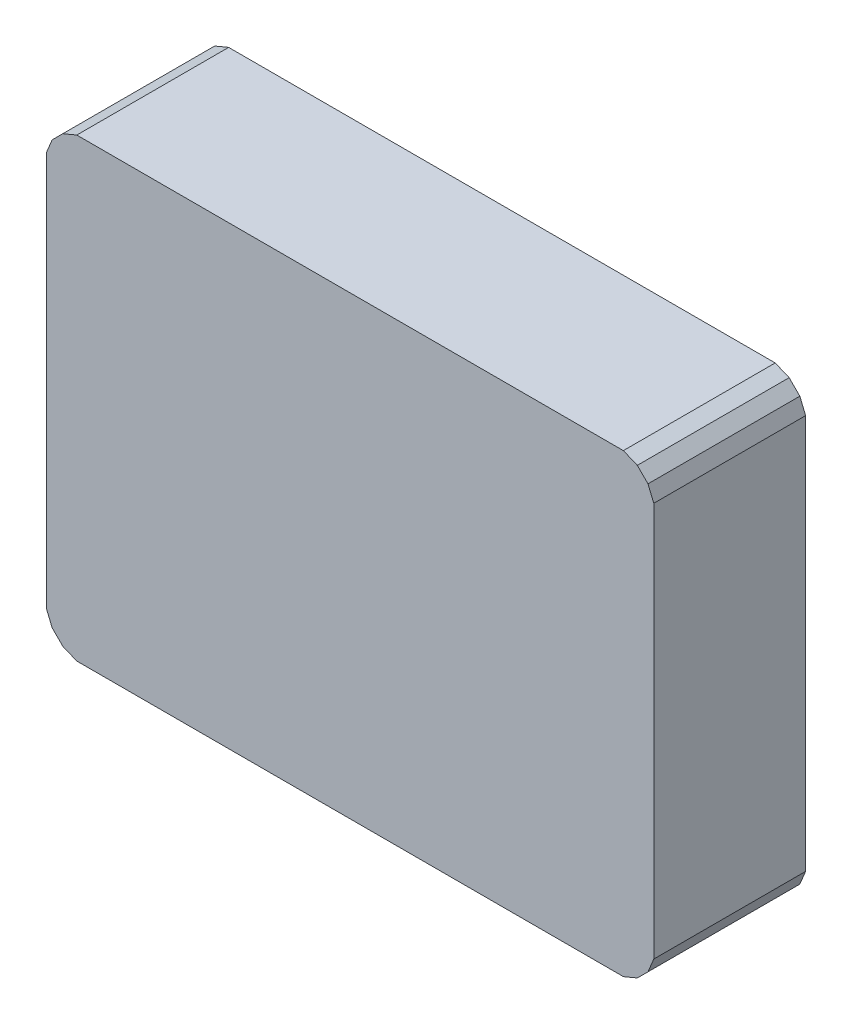
ISO-10303-21;
HEADER;
FILE_DESCRIPTION(('STEP AP214'),'2;1');
FILE_NAME('part.step','',(''),(''),'','','');
FILE_SCHEMA(('AUTOMOTIVE_DESIGN { 1 0 10303 214 1 1 1 1 }'));
ENDSEC;
DATA;
#1=APPLICATION_CONTEXT('core data for automotive mechanical design processes');
#2=APPLICATION_PROTOCOL_DEFINITION('international standard','automotive_design',2000,#1);
#3=PRODUCT_CONTEXT('',#1,'mechanical');
#4=PRODUCT('Part','Part','',(#3));
#5=PRODUCT_RELATED_PRODUCT_CATEGORY('part','',(#4));
#6=PRODUCT_DEFINITION_FORMATION('','',#4);
#7=PRODUCT_DEFINITION_CONTEXT('part definition',#1,'design');
#8=PRODUCT_DEFINITION('design','',#6,#7);
#9=PRODUCT_DEFINITION_SHAPE('','',#8);
#10=(LENGTH_UNIT() NAMED_UNIT(*) SI_UNIT(.MILLI.,.METRE.));
#11=(NAMED_UNIT(*) PLANE_ANGLE_UNIT() SI_UNIT($,.RADIAN.));
#12=(NAMED_UNIT(*) SI_UNIT($,.STERADIAN.) SOLID_ANGLE_UNIT());
#13=UNCERTAINTY_MEASURE_WITH_UNIT(LENGTH_MEASURE(1.E-05),#10,'distance_accuracy_value','');
#14=(GEOMETRIC_REPRESENTATION_CONTEXT(3) GLOBAL_UNCERTAINTY_ASSIGNED_CONTEXT((#13)) GLOBAL_UNIT_ASSIGNED_CONTEXT((#10,
#11,#12)) REPRESENTATION_CONTEXT('',''));
#15=CARTESIAN_POINT('',(0.,0.,0.));
#16=DIRECTION('',(0.,0.,1.));
#17=DIRECTION('',(1.,0.,0.));
#18=AXIS2_PLACEMENT_3D('',#15,#16,#17);
#19=CARTESIAN_POINT('',(2.00000108,1.25000004,1.00000054));
#20=DIRECTION('',(0.,0.,-1.));
#21=DIRECTION('',(-1.,0.,0.));
#22=AXIS2_PLACEMENT_3D('',#19,#20,#21);
#23=PLANE('',#22);
#24=DIRECTION('',(0.382692373326559,-0.923875828993099,0.));
#25=VECTOR('',#24,1.);
#26=CARTESIAN_POINT('',(1.96193918,1.39161266,1.00000054));
#27=LINE('',#26,#25);
#28=CARTESIAN_POINT('',(1.96193917999999,1.39161266,1.00000054));
#29=VERTEX_POINT('',#28);
#30=CARTESIAN_POINT('',(2.00000108,1.29972562,1.00000054));
#31=VERTEX_POINT('',#30);
#32=EDGE_CURVE('E149',#29,#31,#27,.T.);
#33=ORIENTED_EDGE('',*,*,#32,.F.);
#34=DIRECTION('',(0.707106781186547,-0.707106781186547,0.));
#35=VECTOR('',#34,1.);
#36=CARTESIAN_POINT('',(1.8916142,1.46193764,1.00000054));
#37=LINE('',#36,#35);
#38=CARTESIAN_POINT('',(1.8916142,1.46193764,1.00000054));
#39=VERTEX_POINT('',#38);
#40=EDGE_CURVE('E148',#39,#29,#37,.T.);
#41=ORIENTED_EDGE('',*,*,#40,.F.);
#42=DIRECTION('',(0.923875828993099,-0.382692373326558,0.));
#43=VECTOR('',#42,1.);
#44=CARTESIAN_POINT('',(1.79972716,1.49999954,1.00000054));
#45=LINE('',#44,#43);
#46=CARTESIAN_POINT('',(1.79972716,1.49999954000001,1.00000054));
#47=VERTEX_POINT('',#46);
#48=EDGE_CURVE('E20',#47,#39,#45,.T.);
#49=ORIENTED_EDGE('',*,*,#48,.F.);
#50=DIRECTION('',(1.,0.,0.));
#51=VECTOR('',#50,1.);
#52=CARTESIAN_POINT('',(1.75000158,1.49999954,1.00000054));
#53=LINE('',#52,#51);
#54=CARTESIAN_POINT('',(-1.79972716,1.49999954,1.00000054));
#55=VERTEX_POINT('',#54);
#56=EDGE_CURVE('E132',#47,#55,#53,.F.);
#57=ORIENTED_EDGE('',*,*,#56,.T.);
#58=DIRECTION('',(0.923875828992928,0.38269237332697,0.));
#59=VECTOR('',#58,1.);
#60=CARTESIAN_POINT('',(-1.79972716,1.49999954,1.00000054));
#61=LINE('',#60,#59);
#62=CARTESIAN_POINT('',(-1.8916142,1.46193763999999,1.00000054));
#63=VERTEX_POINT('',#62);
#64=EDGE_CURVE('E199',#55,#63,#61,.F.);
#65=ORIENTED_EDGE('',*,*,#64,.T.);
#66=DIRECTION('',(0.707106781186548,0.707106781186548,0.));
#67=VECTOR('',#66,1.);
#68=CARTESIAN_POINT('',(-1.8916142,1.46193764,1.00000054));
#69=LINE('',#68,#67);
#70=CARTESIAN_POINT('',(-1.96193918,1.39161266,1.00000054));
#71=VERTEX_POINT('',#70);
#72=EDGE_CURVE('E195',#63,#71,#69,.F.);
#73=ORIENTED_EDGE('',*,*,#72,.T.);
#74=DIRECTION('',(0.382670574824983,0.923884858173959,0.));
#75=VECTOR('',#74,1.);
#76=CARTESIAN_POINT('',(-1.96193918,1.39161266,1.00000054));
#77=LINE('',#76,#75);
#78=CARTESIAN_POINT('',(-1.99999853999999,1.29972562,1.00000054));
#79=VERTEX_POINT('',#78);
#80=EDGE_CURVE('E190',#71,#79,#77,.F.);
#81=ORIENTED_EDGE('',*,*,#80,.T.);
#82=DIRECTION('',(0.,1.,0.));
#83=VECTOR('',#82,1.);
#84=CARTESIAN_POINT('',(-1.99999854,1.29972562,1.00000054));
#85=LINE('',#84,#83);
#86=CARTESIAN_POINT('',(-1.99999854,-1.29972816,1.00000054));
#87=VERTEX_POINT('',#86);
#88=EDGE_CURVE('E188',#79,#87,#85,.F.);
#89=ORIENTED_EDGE('',*,*,#88,.T.);
#90=DIRECTION('',(-0.382670574824983,0.923884858173959,0.));
#91=VECTOR('',#90,1.);
#92=CARTESIAN_POINT('',(-1.99999854,-1.29972816,1.00000054));
#93=LINE('',#92,#91);
#94=CARTESIAN_POINT('',(-1.96193918000001,-1.3916152,1.00000054));
#95=VERTEX_POINT('',#94);
#96=EDGE_CURVE('E182',#87,#95,#93,.F.);
#97=ORIENTED_EDGE('',*,*,#96,.T.);
#98=DIRECTION('',(-0.707106781186548,0.707106781186548,0.));
#99=VECTOR('',#98,1.);
#100=CARTESIAN_POINT('',(-1.96193918,-1.3916152,1.00000054));
#101=LINE('',#100,#99);
#102=CARTESIAN_POINT('',(-1.8916142,-1.46194018,1.00000054));
#103=VERTEX_POINT('',#102);
#104=EDGE_CURVE('E178',#95,#103,#101,.F.);
#105=ORIENTED_EDGE('',*,*,#104,.T.);
#106=DIRECTION('',(-0.923884858173959,0.382670574824983,0.));
#107=VECTOR('',#106,1.);
#108=CARTESIAN_POINT('',(-1.8916142,-1.46194018,1.00000054));
#109=LINE('',#108,#107);
#110=CARTESIAN_POINT('',(-1.79972716,-1.49999953999999,1.00000054));
#111=VERTEX_POINT('',#110);
#112=EDGE_CURVE('E173',#103,#111,#109,.F.);
#113=ORIENTED_EDGE('',*,*,#112,.T.);
#114=DIRECTION('',(1.,0.,0.));
#115=VECTOR('',#114,1.);
#116=CARTESIAN_POINT('',(-1.79972716,-1.49999954,1.00000054));
#117=LINE('',#116,#115);
#118=CARTESIAN_POINT('',(1.79972716,-1.49999954,1.00000054));
#119=VERTEX_POINT('',#118);
#120=EDGE_CURVE('E171',#111,#119,#117,.T.);
#121=ORIENTED_EDGE('',*,*,#120,.T.);
#122=DIRECTION('',(-0.923884858173959,-0.382670574824983,0.));
#123=VECTOR('',#122,1.);
#124=CARTESIAN_POINT('',(1.79972716,-1.49999954,1.00000054));
#125=LINE('',#124,#123);
#126=CARTESIAN_POINT('',(1.8916142,-1.46194018000001,1.00000054));
#127=VERTEX_POINT('',#126);
#128=EDGE_CURVE('E165',#119,#127,#125,.F.);
#129=ORIENTED_EDGE('',*,*,#128,.T.);
#130=DIRECTION('',(-0.707106781186548,-0.707106781186548,0.));
#131=VECTOR('',#130,1.);
#132=CARTESIAN_POINT('',(1.8916142,-1.46194018,1.00000054));
#133=LINE('',#132,#131);
#134=CARTESIAN_POINT('',(1.96193918,-1.3916152,1.00000054));
#135=VERTEX_POINT('',#134);
#136=EDGE_CURVE('E161',#127,#135,#133,.F.);
#137=ORIENTED_EDGE('',*,*,#136,.T.);
#138=DIRECTION('',(-0.38269237332697,-0.923875828992928,0.));
#139=VECTOR('',#138,1.);
#140=CARTESIAN_POINT('',(1.96193918,-1.3916152,1.00000054));
#141=LINE('',#140,#139);
#142=CARTESIAN_POINT('',(2.00000108000001,-1.29972816,1.00000054));
#143=VERTEX_POINT('',#142);
#144=EDGE_CURVE('E157',#135,#143,#141,.F.);
#145=ORIENTED_EDGE('',*,*,#144,.T.);
#146=DIRECTION('',(0.,1.,0.));
#147=VECTOR('',#146,1.);
#148=CARTESIAN_POINT('',(2.00000108,-1.29972816,1.00000054));
#149=LINE('',#148,#147);
#150=EDGE_CURVE('E153',#143,#31,#149,.T.);
#151=ORIENTED_EDGE('',*,*,#150,.T.);
#152=EDGE_LOOP('',(#33,#41,#49,#57,#65,#73,#81,#89,#97,#105,#113,#121,#129,#137,#145,#151));
#153=FACE_BOUND('',#152,.T.);
#154=ADVANCED_FACE('F17',(#153),#23,.F.);
#155=CARTESIAN_POINT('',(1.96193918,-1.3916152,0.));
#156=DIRECTION('',(-0.923875828992928,0.38269237332697,0.));
#157=DIRECTION('',(-0.38269237332697,-0.923875828992928,0.));
#158=AXIS2_PLACEMENT_3D('',#155,#156,#157);
#159=PLANE('',#158);
#160=DIRECTION('',(0.,0.,1.));
#161=VECTOR('',#160,1.);
#162=CARTESIAN_POINT('',(2.00000108000004,-1.29972816000002,0.));
#163=LINE('',#162,#161);
#164=CARTESIAN_POINT('',(2.00000108000001,-1.29972816,0.));
#165=VERTEX_POINT('',#164);
#166=EDGE_CURVE('E159',#143,#165,#163,.F.);
#167=ORIENTED_EDGE('',*,*,#166,.F.);
#168=ORIENTED_EDGE('',*,*,#144,.F.);
#169=DIRECTION('',(0.,0.,1.));
#170=VECTOR('',#169,1.);
#171=CARTESIAN_POINT('',(1.96193918,-1.3916152,0.));
#172=LINE('',#171,#170);
#173=CARTESIAN_POINT('',(1.96193918,-1.3916152,0.));
#174=VERTEX_POINT('',#173);
#175=EDGE_CURVE('E163',#135,#174,#172,.F.);
#176=ORIENTED_EDGE('',*,*,#175,.T.);
#177=DIRECTION('',(-0.382692373326561,-0.923875828993098,0.));
#178=VECTOR('',#177,1.);
#179=CARTESIAN_POINT('',(2.00000108,-1.29972816,0.));
#180=LINE('',#179,#178);
#181=EDGE_CURVE('E210',#165,#174,#180,.T.);
#182=ORIENTED_EDGE('',*,*,#181,.F.);
#183=EDGE_LOOP('',(#167,#168,#176,#182));
#184=FACE_BOUND('',#183,.T.);
#185=ADVANCED_FACE('F258',(#184),#159,.F.);
#186=CARTESIAN_POINT('',(1.8916142,-1.46194018,0.));
#187=DIRECTION('',(-0.707106781186548,0.707106781186548,0.));
#188=DIRECTION('',(-0.707106781186548,-0.707106781186548,0.));
#189=AXIS2_PLACEMENT_3D('',#186,#187,#188);
#190=PLANE('',#189);
#191=ORIENTED_EDGE('',*,*,#175,.F.);
#192=ORIENTED_EDGE('',*,*,#136,.F.);
#193=DIRECTION('',(0.,0.,1.));
#194=VECTOR('',#193,1.);
#195=CARTESIAN_POINT('',(1.89161420000001,-1.46194018000002,0.));
#196=LINE('',#195,#194);
#197=CARTESIAN_POINT('',(1.8916142,-1.46194018000001,0.));
#198=VERTEX_POINT('',#197);
#199=EDGE_CURVE('E167',#127,#198,#196,.F.);
#200=ORIENTED_EDGE('',*,*,#199,.T.);
#201=DIRECTION('',(-0.707106781186544,-0.707106781186551,0.));
#202=VECTOR('',#201,1.);
#203=CARTESIAN_POINT('',(1.96193918,-1.3916152,0.));
#204=LINE('',#203,#202);
#205=EDGE_CURVE('E213',#174,#198,#204,.T.);
#206=ORIENTED_EDGE('',*,*,#205,.F.);
#207=EDGE_LOOP('',(#191,#192,#200,#206));
#208=FACE_BOUND('',#207,.T.);
#209=ADVANCED_FACE('F263',(#208),#190,.F.);
#210=CARTESIAN_POINT('',(1.79972716,-1.49999954,0.));
#211=DIRECTION('',(-0.382670574824983,0.923884858173959,0.));
#212=DIRECTION('',(-0.923884858173959,-0.382670574824983,0.));
#213=AXIS2_PLACEMENT_3D('',#210,#211,#212);
#214=PLANE('',#213);
#215=ORIENTED_EDGE('',*,*,#199,.F.);
#216=ORIENTED_EDGE('',*,*,#128,.F.);
#217=DIRECTION('',(0.,0.,1.));
#218=VECTOR('',#217,1.);
#219=CARTESIAN_POINT('',(1.79972716,-1.49999954,0.));
#220=LINE('',#219,#218);
#221=CARTESIAN_POINT('',(1.79972716,-1.49999954,0.));
#222=VERTEX_POINT('',#221);
#223=EDGE_CURVE('E169',#119,#222,#220,.F.);
#224=ORIENTED_EDGE('',*,*,#223,.T.);
#225=DIRECTION('',(-0.923884858173863,-0.382670574825215,0.));
#226=VECTOR('',#225,1.);
#227=CARTESIAN_POINT('',(1.8916142,-1.46194018,0.));
#228=LINE('',#227,#226);
#229=EDGE_CURVE('E216',#198,#222,#228,.T.);
#230=ORIENTED_EDGE('',*,*,#229,.F.);
#231=EDGE_LOOP('',(#215,#216,#224,#230));
#232=FACE_BOUND('',#231,.T.);
#233=ADVANCED_FACE('F268',(#232),#214,.F.);
#234=CARTESIAN_POINT('',(-1.79972716,-1.49999954,0.));
#235=DIRECTION('',(0.,1.,0.));
#236=DIRECTION('',(0.,0.,1.));
#237=AXIS2_PLACEMENT_3D('',#234,#235,#236);
#238=PLANE('',#237);
#239=DIRECTION('',(0.,0.,1.));
#240=VECTOR('',#239,1.);
#241=CARTESIAN_POINT('',(-1.79972715999999,-1.49999953999998,0.));
#242=LINE('',#241,#240);
#243=CARTESIAN_POINT('',(-1.79972716,-1.49999953999999,0.));
#244=VERTEX_POINT('',#243);
#245=EDGE_CURVE('E175',#111,#244,#242,.F.);
#246=ORIENTED_EDGE('',*,*,#245,.T.);
#247=DIRECTION('',(-1.,0.,0.));
#248=VECTOR('',#247,1.);
#249=CARTESIAN_POINT('',(2.00000108,-1.49999954,0.));
#250=LINE('',#249,#248);
#251=EDGE_CURVE('E219',#222,#244,#250,.T.);
#252=ORIENTED_EDGE('',*,*,#251,.F.);
#253=ORIENTED_EDGE('',*,*,#223,.F.);
#254=ORIENTED_EDGE('',*,*,#120,.F.);
#255=EDGE_LOOP('',(#246,#252,#253,#254));
#256=FACE_BOUND('',#255,.T.);
#257=ADVANCED_FACE('F273',(#256),#238,.F.);
#258=CARTESIAN_POINT('',(-1.8916142,-1.46194018,0.));
#259=DIRECTION('',(0.382670574824983,0.923884858173959,0.));
#260=DIRECTION('',(-0.923884858173959,0.382670574824983,0.));
#261=AXIS2_PLACEMENT_3D('',#258,#259,#260);
#262=PLANE('',#261);
#263=ORIENTED_EDGE('',*,*,#245,.F.);
#264=ORIENTED_EDGE('',*,*,#112,.F.);
#265=DIRECTION('',(0.,0.,1.));
#266=VECTOR('',#265,1.);
#267=CARTESIAN_POINT('',(-1.8916142,-1.46194018,0.));
#268=LINE('',#267,#266);
#269=CARTESIAN_POINT('',(-1.8916142,-1.46194018,0.));
#270=VERTEX_POINT('',#269);
#271=EDGE_CURVE('E180',#103,#270,#268,.F.);
#272=ORIENTED_EDGE('',*,*,#271,.T.);
#273=DIRECTION('',(-0.923884858173863,0.382670574825216,0.));
#274=VECTOR('',#273,1.);
#275=CARTESIAN_POINT('',(-1.79972716,-1.49999954,0.));
#276=LINE('',#275,#274);
#277=EDGE_CURVE('E221',#244,#270,#276,.T.);
#278=ORIENTED_EDGE('',*,*,#277,.F.);
#279=EDGE_LOOP('',(#263,#264,#272,#278));
#280=FACE_BOUND('',#279,.T.);
#281=ADVANCED_FACE('F278',(#280),#262,.F.);
#282=CARTESIAN_POINT('',(-1.96193918,-1.3916152,0.));
#283=DIRECTION('',(0.707106781186548,0.707106781186548,0.));
#284=DIRECTION('',(-0.707106781186548,0.707106781186548,0.));
#285=AXIS2_PLACEMENT_3D('',#282,#283,#284);
#286=PLANE('',#285);
#287=ORIENTED_EDGE('',*,*,#271,.F.);
#288=ORIENTED_EDGE('',*,*,#104,.F.);
#289=DIRECTION('',(0.,0.,1.));
#290=VECTOR('',#289,1.);
#291=CARTESIAN_POINT('',(-1.96193918000002,-1.39161520000001,0.));
#292=LINE('',#291,#290);
#293=CARTESIAN_POINT('',(-1.96193918000001,-1.3916152,0.));
#294=VERTEX_POINT('',#293);
#295=EDGE_CURVE('E184',#95,#294,#292,.F.);
#296=ORIENTED_EDGE('',*,*,#295,.T.);
#297=DIRECTION('',(-0.707106781186543,0.707106781186552,0.));
#298=VECTOR('',#297,1.);
#299=CARTESIAN_POINT('',(-1.8916142,-1.46194018,0.));
#300=LINE('',#299,#298);
#301=EDGE_CURVE('E224',#270,#294,#300,.T.);
#302=ORIENTED_EDGE('',*,*,#301,.F.);
#303=EDGE_LOOP('',(#287,#288,#296,#302));
#304=FACE_BOUND('',#303,.T.);
#305=ADVANCED_FACE('F283',(#304),#286,.F.);
#306=CARTESIAN_POINT('',(-1.99999854,-1.29972816,0.));
#307=DIRECTION('',(0.923884858173959,0.382670574824983,0.));
#308=DIRECTION('',(-0.382670574824983,0.923884858173959,0.));
#309=AXIS2_PLACEMENT_3D('',#306,#307,#308);
#310=PLANE('',#309);
#311=ORIENTED_EDGE('',*,*,#295,.F.);
#312=ORIENTED_EDGE('',*,*,#96,.F.);
#313=DIRECTION('',(0.,0.,-1.));
#314=VECTOR('',#313,1.);
#315=CARTESIAN_POINT('',(-1.99999854,-1.29972816,0.));
#316=LINE('',#315,#314);
#317=CARTESIAN_POINT('',(-1.99999854,-1.29972816,0.));
#318=VERTEX_POINT('',#317);
#319=EDGE_CURVE('E186',#87,#318,#316,.T.);
#320=ORIENTED_EDGE('',*,*,#319,.T.);
#321=DIRECTION('',(-0.382670574825224,0.92388485817386,0.));
#322=VECTOR('',#321,1.);
#323=CARTESIAN_POINT('',(-1.96193918,-1.3916152,0.));
#324=LINE('',#323,#322);
#325=EDGE_CURVE('E227',#294,#318,#324,.T.);
#326=ORIENTED_EDGE('',*,*,#325,.F.);
#327=EDGE_LOOP('',(#311,#312,#320,#326));
#328=FACE_BOUND('',#327,.T.);
#329=ADVANCED_FACE('F288',(#328),#310,.F.);
#330=CARTESIAN_POINT('',(-1.99999854,1.29972562,0.));
#331=DIRECTION('',(1.,0.,0.));
#332=DIRECTION('',(0.,0.,-1.));
#333=AXIS2_PLACEMENT_3D('',#330,#331,#332);
#334=PLANE('',#333);
#335=DIRECTION('',(0.,0.,1.));
#336=VECTOR('',#335,1.);
#337=CARTESIAN_POINT('',(-1.99999853999998,1.29972561999999,0.));
#338=LINE('',#337,#336);
#339=CARTESIAN_POINT('',(-1.99999853999999,1.29972562,0.));
#340=VERTEX_POINT('',#339);
#341=EDGE_CURVE('E192',#79,#340,#338,.F.);
#342=ORIENTED_EDGE('',*,*,#341,.T.);
#343=DIRECTION('',(0.,1.,0.));
#344=VECTOR('',#343,1.);
#345=CARTESIAN_POINT('',(-1.99999854,1.25000004,0.));
#346=LINE('',#345,#344);
#347=EDGE_CURVE('E230',#318,#340,#346,.T.);
#348=ORIENTED_EDGE('',*,*,#347,.F.);
#349=ORIENTED_EDGE('',*,*,#319,.F.);
#350=ORIENTED_EDGE('',*,*,#88,.F.);
#351=EDGE_LOOP('',(#342,#348,#349,#350));
#352=FACE_BOUND('',#351,.T.);
#353=ADVANCED_FACE('F295',(#352),#334,.F.);
#354=CARTESIAN_POINT('',(-1.96193918,1.39161266,0.));
#355=DIRECTION('',(0.923884858173959,-0.382670574824983,0.));
#356=DIRECTION('',(0.382670574824983,0.923884858173959,0.));
#357=AXIS2_PLACEMENT_3D('',#354,#355,#356);
#358=PLANE('',#357);
#359=ORIENTED_EDGE('',*,*,#341,.F.);
#360=ORIENTED_EDGE('',*,*,#80,.F.);
#361=DIRECTION('',(0.,0.,1.));
#362=VECTOR('',#361,1.);
#363=CARTESIAN_POINT('',(-1.96193918,1.39161266,0.));
#364=LINE('',#363,#362);
#365=CARTESIAN_POINT('',(-1.96193918,1.39161266,0.));
#366=VERTEX_POINT('',#365);
#367=EDGE_CURVE('E197',#71,#366,#364,.F.);
#368=ORIENTED_EDGE('',*,*,#367,.T.);
#369=DIRECTION('',(0.382670574825221,0.923884858173861,0.));
#370=VECTOR('',#369,1.);
#371=CARTESIAN_POINT('',(-1.99999854,1.29972562,0.));
#372=LINE('',#371,#370);
#373=EDGE_CURVE('E232',#340,#366,#372,.T.);
#374=ORIENTED_EDGE('',*,*,#373,.F.);
#375=EDGE_LOOP('',(#359,#360,#368,#374));
#376=FACE_BOUND('',#375,.T.);
#377=ADVANCED_FACE('F298',(#376),#358,.F.);
#378=CARTESIAN_POINT('',(-1.8916142,1.46193764,0.));
#379=DIRECTION('',(0.707106781186548,-0.707106781186548,0.));
#380=DIRECTION('',(0.707106781186548,0.707106781186548,0.));
#381=AXIS2_PLACEMENT_3D('',#378,#379,#380);
#382=PLANE('',#381);
#383=ORIENTED_EDGE('',*,*,#367,.F.);
#384=ORIENTED_EDGE('',*,*,#72,.F.);
#385=DIRECTION('',(0.,0.,1.));
#386=VECTOR('',#385,1.);
#387=CARTESIAN_POINT('',(-1.89161419999998,1.46193763999996,0.));
#388=LINE('',#387,#386);
#389=CARTESIAN_POINT('',(-1.8916142,1.46193763999999,0.));
#390=VERTEX_POINT('',#389);
#391=EDGE_CURVE('E201',#63,#390,#388,.F.);
#392=ORIENTED_EDGE('',*,*,#391,.T.);
#393=DIRECTION('',(0.707106781186546,0.707106781186549,0.));
#394=VECTOR('',#393,1.);
#395=CARTESIAN_POINT('',(-1.96193918,1.39161266,0.));
#396=LINE('',#395,#394);
#397=EDGE_CURVE('E235',#366,#390,#396,.T.);
#398=ORIENTED_EDGE('',*,*,#397,.F.);
#399=EDGE_LOOP('',(#383,#384,#392,#398));
#400=FACE_BOUND('',#399,.T.);
#401=ADVANCED_FACE('F303',(#400),#382,.F.);
#402=CARTESIAN_POINT('',(-1.79972716,1.49999954,0.));
#403=DIRECTION('',(0.38269237332697,-0.923875828992928,0.));
#404=DIRECTION('',(0.923875828992928,0.38269237332697,0.));
#405=AXIS2_PLACEMENT_3D('',#402,#403,#404);
#406=PLANE('',#405);
#407=ORIENTED_EDGE('',*,*,#391,.F.);
#408=ORIENTED_EDGE('',*,*,#64,.F.);
#409=DIRECTION('',(0.,0.,-1.));
#410=VECTOR('',#409,1.);
#411=CARTESIAN_POINT('',(-1.79972716,1.49999954,0.));
#412=LINE('',#411,#410);
#413=CARTESIAN_POINT('',(-1.79972716,1.49999954,0.));
#414=VERTEX_POINT('',#413);
#415=EDGE_CURVE('E137',#55,#414,#412,.T.);
#416=ORIENTED_EDGE('',*,*,#415,.T.);
#417=DIRECTION('',(0.923875828993099,0.38269237332656,0.));
#418=VECTOR('',#417,1.);
#419=CARTESIAN_POINT('',(-1.8916142,1.46193764,0.));
#420=LINE('',#419,#418);
#421=EDGE_CURVE('E238',#390,#414,#420,.T.);
#422=ORIENTED_EDGE('',*,*,#421,.F.);
#423=EDGE_LOOP('',(#407,#408,#416,#422));
#424=FACE_BOUND('',#423,.T.);
#425=ADVANCED_FACE('F307',(#424),#406,.F.);
#426=CARTESIAN_POINT('',(1.79972716,1.49999954,0.));
#427=DIRECTION('',(0.,-1.,0.));
#428=DIRECTION('',(0.,0.,-1.));
#429=AXIS2_PLACEMENT_3D('',#426,#427,#428);
#430=PLANE('',#429);
#431=DIRECTION('',(0.,0.,1.));
#432=VECTOR('',#431,1.);
#433=CARTESIAN_POINT('',(1.79972716000002,1.49999954000004,0.));
#434=LINE('',#433,#432);
#435=CARTESIAN_POINT('',(1.79972716,1.49999954000001,0.));
#436=VERTEX_POINT('',#435);
#437=EDGE_CURVE('E135',#47,#436,#434,.F.);
#438=ORIENTED_EDGE('',*,*,#437,.T.);
#439=DIRECTION('',(-1.,0.,0.));
#440=VECTOR('',#439,1.);
#441=CARTESIAN_POINT('',(2.00000108,1.49999954,0.));
#442=LINE('',#441,#440);
#443=EDGE_CURVE('E241',#414,#436,#442,.F.);
#444=ORIENTED_EDGE('',*,*,#443,.F.);
#445=ORIENTED_EDGE('',*,*,#415,.F.);
#446=ORIENTED_EDGE('',*,*,#56,.F.);
#447=EDGE_LOOP('',(#438,#444,#445,#446));
#448=FACE_BOUND('',#447,.T.);
#449=ADVANCED_FACE('F133',(#448),#430,.F.);
#450=CARTESIAN_POINT('',(1.8916142,1.46193764,0.));
#451=DIRECTION('',(-0.38269237332697,-0.923875828992928,0.));
#452=DIRECTION('',(0.923875828992928,-0.38269237332697,0.));
#453=AXIS2_PLACEMENT_3D('',#450,#451,#452);
#454=PLANE('',#453);
#455=ORIENTED_EDGE('',*,*,#437,.F.);
#456=ORIENTED_EDGE('',*,*,#48,.T.);
#457=DIRECTION('',(0.,0.,1.));
#458=VECTOR('',#457,1.);
#459=CARTESIAN_POINT('',(1.8916142,1.46193764,0.));
#460=LINE('',#459,#458);
#461=CARTESIAN_POINT('',(1.8916142,1.46193764,0.));
#462=VERTEX_POINT('',#461);
#463=EDGE_CURVE('E144',#39,#462,#460,.F.);
#464=ORIENTED_EDGE('',*,*,#463,.T.);
#465=DIRECTION('',(0.923875828993099,-0.382692373326558,0.));
#466=VECTOR('',#465,1.);
#467=CARTESIAN_POINT('',(1.79972716,1.49999954,0.));
#468=LINE('',#467,#466);
#469=EDGE_CURVE('E143',#436,#462,#468,.T.);
#470=ORIENTED_EDGE('',*,*,#469,.F.);
#471=EDGE_LOOP('',(#455,#456,#464,#470));
#472=FACE_BOUND('',#471,.T.);
#473=ADVANCED_FACE('F141',(#472),#454,.F.);
#474=CARTESIAN_POINT('',(1.96193918,1.39161266,0.));
#475=DIRECTION('',(-0.707106781186548,-0.707106781186548,0.));
#476=DIRECTION('',(0.707106781186548,-0.707106781186548,0.));
#477=AXIS2_PLACEMENT_3D('',#474,#475,#476);
#478=PLANE('',#477);
#479=ORIENTED_EDGE('',*,*,#463,.F.);
#480=ORIENTED_EDGE('',*,*,#40,.T.);
#481=DIRECTION('',(0.,0.,1.));
#482=VECTOR('',#481,1.);
#483=CARTESIAN_POINT('',(1.96193917999996,1.39161265999998,0.));
#484=LINE('',#483,#482);
#485=CARTESIAN_POINT('',(1.96193917999999,1.39161266,0.));
#486=VERTEX_POINT('',#485);
#487=EDGE_CURVE('E205',#29,#486,#484,.F.);
#488=ORIENTED_EDGE('',*,*,#487,.T.);
#489=DIRECTION('',(0.707106781186547,-0.707106781186547,0.));
#490=VECTOR('',#489,1.);
#491=CARTESIAN_POINT('',(1.8916142,1.46193764,0.));
#492=LINE('',#491,#490);
#493=EDGE_CURVE('E26',#462,#486,#492,.T.);
#494=ORIENTED_EDGE('',*,*,#493,.F.);
#495=EDGE_LOOP('',(#479,#480,#488,#494));
#496=FACE_BOUND('',#495,.T.);
#497=ADVANCED_FACE('F249',(#496),#478,.F.);
#498=CARTESIAN_POINT('',(2.00000108,1.29972562,0.));
#499=DIRECTION('',(-0.923875828992928,-0.38269237332697,0.));
#500=DIRECTION('',(0.38269237332697,-0.923875828992928,0.));
#501=AXIS2_PLACEMENT_3D('',#498,#499,#500);
#502=PLANE('',#501);
#503=ORIENTED_EDGE('',*,*,#487,.F.);
#504=ORIENTED_EDGE('',*,*,#32,.T.);
#505=DIRECTION('',(0.,0.,1.));
#506=VECTOR('',#505,1.);
#507=CARTESIAN_POINT('',(2.00000108,1.29972562,0.));
#508=LINE('',#507,#506);
#509=CARTESIAN_POINT('',(2.00000108,1.29972562,0.));
#510=VERTEX_POINT('',#509);
#511=EDGE_CURVE('E207',#31,#510,#508,.F.);
#512=ORIENTED_EDGE('',*,*,#511,.T.);
#513=DIRECTION('',(0.382692373326559,-0.923875828993099,0.));
#514=VECTOR('',#513,1.);
#515=CARTESIAN_POINT('',(1.96193918,1.39161266,0.));
#516=LINE('',#515,#514);
#517=EDGE_CURVE('E11',#486,#510,#516,.T.);
#518=ORIENTED_EDGE('',*,*,#517,.F.);
#519=EDGE_LOOP('',(#503,#504,#512,#518));
#520=FACE_BOUND('',#519,.T.);
#521=ADVANCED_FACE('F251',(#520),#502,.F.);
#522=CARTESIAN_POINT('',(2.00000108,1.25000004,0.));
#523=DIRECTION('',(-1.,0.,0.));
#524=DIRECTION('',(0.,0.,1.));
#525=AXIS2_PLACEMENT_3D('',#522,#523,#524);
#526=PLANE('',#525);
#527=ORIENTED_EDGE('',*,*,#511,.F.);
#528=ORIENTED_EDGE('',*,*,#150,.F.);
#529=ORIENTED_EDGE('',*,*,#166,.T.);
#530=DIRECTION('',(0.,1.,0.));
#531=VECTOR('',#530,1.);
#532=CARTESIAN_POINT('',(2.00000108,1.25000004,0.));
#533=LINE('',#532,#531);
#534=EDGE_CURVE('E35',#510,#165,#533,.F.);
#535=ORIENTED_EDGE('',*,*,#534,.F.);
#536=EDGE_LOOP('',(#527,#528,#529,#535));
#537=FACE_BOUND('',#536,.T.);
#538=ADVANCED_FACE('F253',(#537),#526,.F.);
#539=CARTESIAN_POINT('',(2.00000108,1.25000004,0.));
#540=DIRECTION('',(0.,0.,-1.));
#541=DIRECTION('',(-1.,0.,0.));
#542=AXIS2_PLACEMENT_3D('',#539,#540,#541);
#543=PLANE('',#542);
#544=ORIENTED_EDGE('',*,*,#517,.T.);
#545=ORIENTED_EDGE('',*,*,#534,.T.);
#546=ORIENTED_EDGE('',*,*,#181,.T.);
#547=ORIENTED_EDGE('',*,*,#205,.T.);
#548=ORIENTED_EDGE('',*,*,#229,.T.);
#549=ORIENTED_EDGE('',*,*,#251,.T.);
#550=ORIENTED_EDGE('',*,*,#277,.T.);
#551=ORIENTED_EDGE('',*,*,#301,.T.);
#552=ORIENTED_EDGE('',*,*,#325,.T.);
#553=ORIENTED_EDGE('',*,*,#347,.T.);
#554=ORIENTED_EDGE('',*,*,#373,.T.);
#555=ORIENTED_EDGE('',*,*,#397,.T.);
#556=ORIENTED_EDGE('',*,*,#421,.T.);
#557=ORIENTED_EDGE('',*,*,#443,.T.);
#558=ORIENTED_EDGE('',*,*,#469,.T.);
#559=ORIENTED_EDGE('',*,*,#493,.T.);
#560=EDGE_LOOP('',(#544,#545,#546,#547,#548,#549,#550,#551,#552,#553,#554,#555,#556,#557,#558,#559));
#561=FACE_BOUND('',#560,.T.);
#562=ADVANCED_FACE('F247',(#561),#543,.T.);
#563=CLOSED_SHELL('',(#154,#185,#209,#233,#257,#281,#305,#329,#353,#377,#401,#425,#449,#473,
#497,#521,#538,#562));
#564=MANIFOLD_SOLID_BREP('B1',#563);
#565=ADVANCED_BREP_SHAPE_REPRESENTATION('',(#18,#564),#14);
#566=SHAPE_DEFINITION_REPRESENTATION(#9,#565);
ENDSEC;
END-ISO-10303-21;
